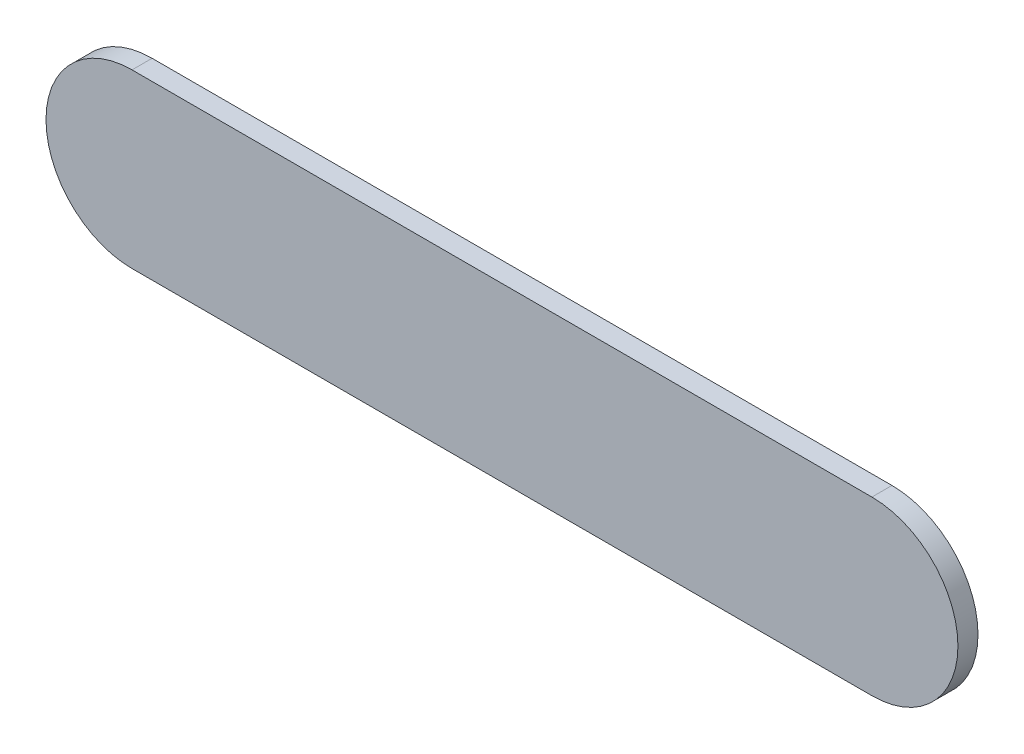
ISO-10303-21;
HEADER;
FILE_DESCRIPTION(('STEP AP214'),'2;1');
FILE_NAME('part.step','',(''),(''),'','','');
FILE_SCHEMA(('AUTOMOTIVE_DESIGN { 1 0 10303 214 1 1 1 1 }'));
ENDSEC;
DATA;
#1=APPLICATION_CONTEXT('core data for automotive mechanical design processes');
#2=APPLICATION_PROTOCOL_DEFINITION('international standard','automotive_design',2000,#1);
#3=PRODUCT_CONTEXT('',#1,'mechanical');
#4=PRODUCT('Part','Part','',(#3));
#5=PRODUCT_RELATED_PRODUCT_CATEGORY('part','',(#4));
#6=PRODUCT_DEFINITION_FORMATION('','',#4);
#7=PRODUCT_DEFINITION_CONTEXT('part definition',#1,'design');
#8=PRODUCT_DEFINITION('design','',#6,#7);
#9=PRODUCT_DEFINITION_SHAPE('','',#8);
#10=(LENGTH_UNIT() NAMED_UNIT(*) SI_UNIT(.MILLI.,.METRE.));
#11=(NAMED_UNIT(*) PLANE_ANGLE_UNIT() SI_UNIT($,.RADIAN.));
#12=(NAMED_UNIT(*) SI_UNIT($,.STERADIAN.) SOLID_ANGLE_UNIT());
#13=UNCERTAINTY_MEASURE_WITH_UNIT(LENGTH_MEASURE(1.E-05),#10,'distance_accuracy_value','');
#14=(GEOMETRIC_REPRESENTATION_CONTEXT(3) GLOBAL_UNCERTAINTY_ASSIGNED_CONTEXT((#13)) GLOBAL_UNIT_ASSIGNED_CONTEXT((#10,
#11,#12)) REPRESENTATION_CONTEXT('',''));
#15=CARTESIAN_POINT('',(0.,0.,0.));
#16=DIRECTION('',(0.,0.,1.));
#17=DIRECTION('',(1.,0.,0.));
#18=AXIS2_PLACEMENT_3D('',#15,#16,#17);
#19=CARTESIAN_POINT('',(95.155,-113.04,1.635));
#20=DIRECTION('',(0.,0.,1.));
#21=DIRECTION('',(1.,0.,0.));
#22=AXIS2_PLACEMENT_3D('',#19,#20,#21);
#23=PLANE('',#22);
#24=DIRECTION('',(-1.,0.,0.));
#25=VECTOR('',#24,1.);
#26=CARTESIAN_POINT('',(95.155,-113.04,1.635));
#27=LINE('',#26,#25);
#28=CARTESIAN_POINT('',(95.155,-113.04,1.635));
#29=VERTEX_POINT('',#28);
#30=CARTESIAN_POINT('',(93.865,-113.04,1.635));
#31=VERTEX_POINT('',#30);
#32=EDGE_CURVE('E79',#29,#31,#27,.T.);
#33=ORIENTED_EDGE('',*,*,#32,.T.);
#34=CARTESIAN_POINT('',(93.865,-113.19,1.635));
#35=DIRECTION('',(0.,0.,1.));
#36=DIRECTION('',(0.,1.,0.));
#37=AXIS2_PLACEMENT_3D('',#34,#35,#36);
#38=CIRCLE('',#37,0.15);
#39=CARTESIAN_POINT('',(93.865,-113.34,1.635));
#40=VERTEX_POINT('',#39);
#41=EDGE_CURVE('E77',#31,#40,#38,.T.);
#42=ORIENTED_EDGE('',*,*,#41,.T.);
#43=DIRECTION('',(1.,0.,0.));
#44=VECTOR('',#43,1.);
#45=CARTESIAN_POINT('',(93.865,-113.34,1.635));
#46=LINE('',#45,#44);
#47=CARTESIAN_POINT('',(95.155,-113.34,1.635));
#48=VERTEX_POINT('',#47);
#49=EDGE_CURVE('E66',#40,#48,#46,.T.);
#50=ORIENTED_EDGE('',*,*,#49,.T.);
#51=CARTESIAN_POINT('',(95.155,-113.19,1.635));
#52=DIRECTION('',(0.,0.,1.));
#53=DIRECTION('',(0.,-1.,0.));
#54=AXIS2_PLACEMENT_3D('',#51,#52,#53);
#55=CIRCLE('',#54,0.15);
#56=EDGE_CURVE('E11',#48,#29,#55,.T.);
#57=ORIENTED_EDGE('',*,*,#56,.T.);
#58=EDGE_LOOP('',(#33,#42,#50,#57));
#59=FACE_BOUND('',#58,.T.);
#60=ADVANCED_FACE('F17',(#59),#23,.T.);
#61=CARTESIAN_POINT('',(95.155,-113.04,1.6));
#62=DIRECTION('',(0.,0.,1.));
#63=DIRECTION('',(1.,0.,0.));
#64=AXIS2_PLACEMENT_3D('',#61,#62,#63);
#65=PLANE('',#64);
#66=CARTESIAN_POINT('',(95.155,-113.19,1.6));
#67=DIRECTION('',(0.,0.,1.));
#68=DIRECTION('',(0.,-1.,0.));
#69=AXIS2_PLACEMENT_3D('',#66,#67,#68);
#70=CIRCLE('',#69,0.15);
#71=CARTESIAN_POINT('',(95.155,-113.34,1.6));
#72=VERTEX_POINT('',#71);
#73=CARTESIAN_POINT('',(95.155,-113.04,1.6));
#74=VERTEX_POINT('',#73);
#75=EDGE_CURVE('E20',#72,#74,#70,.T.);
#76=ORIENTED_EDGE('',*,*,#75,.F.);
#77=DIRECTION('',(1.,0.,0.));
#78=VECTOR('',#77,1.);
#79=CARTESIAN_POINT('',(93.865,-113.34,1.6));
#80=LINE('',#79,#78);
#81=CARTESIAN_POINT('',(93.865,-113.34,1.6));
#82=VERTEX_POINT('',#81);
#83=EDGE_CURVE('E84',#82,#72,#80,.T.);
#84=ORIENTED_EDGE('',*,*,#83,.F.);
#85=CARTESIAN_POINT('',(93.865,-113.19,1.6));
#86=DIRECTION('',(0.,0.,1.));
#87=DIRECTION('',(0.,1.,0.));
#88=AXIS2_PLACEMENT_3D('',#85,#86,#87);
#89=CIRCLE('',#88,0.15);
#90=CARTESIAN_POINT('',(93.865,-113.04,1.6));
#91=VERTEX_POINT('',#90);
#92=EDGE_CURVE('E87',#91,#82,#89,.T.);
#93=ORIENTED_EDGE('',*,*,#92,.F.);
#94=DIRECTION('',(-1.,0.,0.));
#95=VECTOR('',#94,1.);
#96=CARTESIAN_POINT('',(95.155,-113.04,1.6));
#97=LINE('',#96,#95);
#98=EDGE_CURVE('E132',#74,#91,#97,.T.);
#99=ORIENTED_EDGE('',*,*,#98,.F.);
#100=EDGE_LOOP('',(#76,#84,#93,#99));
#101=FACE_BOUND('',#100,.T.);
#102=ADVANCED_FACE('F148',(#101),#65,.F.);
#103=CARTESIAN_POINT('',(95.155,-113.19,1.6));
#104=DIRECTION('',(0.,0.,-1.));
#105=DIRECTION('',(0.,-1.,0.));
#106=AXIS2_PLACEMENT_3D('',#103,#104,#105);
#107=CYLINDRICAL_SURFACE('',#106,0.15);
#108=ORIENTED_EDGE('',*,*,#75,.T.);
#109=DIRECTION('',(0.,0.,1.));
#110=VECTOR('',#109,1.);
#111=CARTESIAN_POINT('',(95.155,-113.04,1.6));
#112=LINE('',#111,#110);
#113=EDGE_CURVE('E94',#74,#29,#112,.T.);
#114=ORIENTED_EDGE('',*,*,#113,.T.);
#115=ORIENTED_EDGE('',*,*,#56,.F.);
#116=DIRECTION('',(0.,0.,1.));
#117=VECTOR('',#116,1.);
#118=CARTESIAN_POINT('',(95.155,-113.34,1.6));
#119=LINE('',#118,#117);
#120=EDGE_CURVE('E73',#72,#48,#119,.T.);
#121=ORIENTED_EDGE('',*,*,#120,.F.);
#122=EDGE_LOOP('',(#108,#114,#115,#121));
#123=FACE_BOUND('',#122,.T.);
#124=ADVANCED_FACE('F149',(#123),#107,.T.);
#125=CARTESIAN_POINT('',(93.865,-113.34,1.6));
#126=DIRECTION('',(0.,1.,0.));
#127=DIRECTION('',(1.,0.,0.));
#128=AXIS2_PLACEMENT_3D('',#125,#126,#127);
#129=PLANE('',#128);
#130=ORIENTED_EDGE('',*,*,#83,.T.);
#131=ORIENTED_EDGE('',*,*,#120,.T.);
#132=ORIENTED_EDGE('',*,*,#49,.F.);
#133=DIRECTION('',(0.,0.,1.));
#134=VECTOR('',#133,1.);
#135=CARTESIAN_POINT('',(93.865,-113.34,1.6));
#136=LINE('',#135,#134);
#137=EDGE_CURVE('E71',#82,#40,#136,.T.);
#138=ORIENTED_EDGE('',*,*,#137,.F.);
#139=EDGE_LOOP('',(#130,#131,#132,#138));
#140=FACE_BOUND('',#139,.T.);
#141=ADVANCED_FACE('F69',(#140),#129,.F.);
#142=CARTESIAN_POINT('',(93.865,-113.19,1.6));
#143=DIRECTION('',(0.,0.,-1.));
#144=DIRECTION('',(0.,1.,0.));
#145=AXIS2_PLACEMENT_3D('',#142,#143,#144);
#146=CYLINDRICAL_SURFACE('',#145,0.15);
#147=ORIENTED_EDGE('',*,*,#92,.T.);
#148=ORIENTED_EDGE('',*,*,#137,.T.);
#149=ORIENTED_EDGE('',*,*,#41,.F.);
#150=DIRECTION('',(0.,0.,1.));
#151=VECTOR('',#150,1.);
#152=CARTESIAN_POINT('',(93.865,-113.04,1.6));
#153=LINE('',#152,#151);
#154=EDGE_CURVE('E127',#91,#31,#153,.T.);
#155=ORIENTED_EDGE('',*,*,#154,.F.);
#156=EDGE_LOOP('',(#147,#148,#149,#155));
#157=FACE_BOUND('',#156,.T.);
#158=ADVANCED_FACE('F86',(#157),#146,.T.);
#159=CARTESIAN_POINT('',(95.155,-113.04,1.6));
#160=DIRECTION('',(0.,-1.,0.));
#161=DIRECTION('',(0.,0.,-1.));
#162=AXIS2_PLACEMENT_3D('',#159,#160,#161);
#163=PLANE('',#162);
#164=ORIENTED_EDGE('',*,*,#98,.T.);
#165=ORIENTED_EDGE('',*,*,#154,.T.);
#166=ORIENTED_EDGE('',*,*,#32,.F.);
#167=ORIENTED_EDGE('',*,*,#113,.F.);
#168=EDGE_LOOP('',(#164,#165,#166,#167));
#169=FACE_BOUND('',#168,.T.);
#170=ADVANCED_FACE('F146',(#169),#163,.F.);
#171=CLOSED_SHELL('',(#60,#102,#124,#141,#158,#170));
#172=MANIFOLD_SOLID_BREP('B1',#171);
#173=ADVANCED_BREP_SHAPE_REPRESENTATION('',(#18,#172),#14);
#174=SHAPE_DEFINITION_REPRESENTATION(#9,#173);
ENDSEC;
END-ISO-10303-21;
